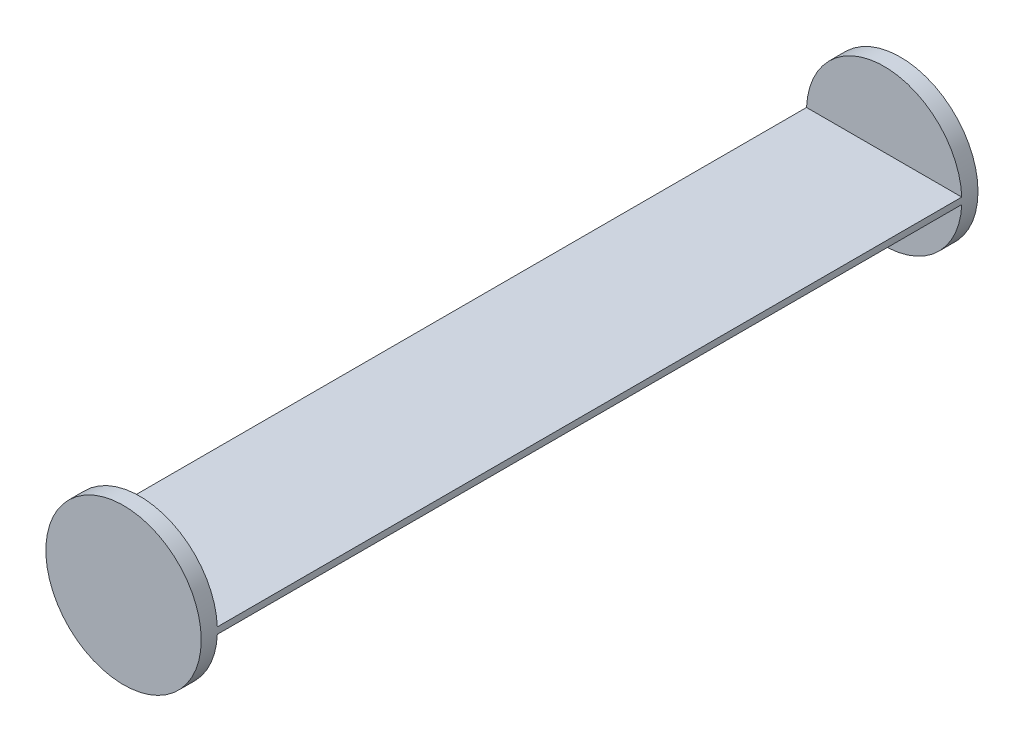
ISO-10303-21;
HEADER;
FILE_DESCRIPTION(('STEP AP214'),'2;1');
FILE_NAME('part.step','',(''),(''),'','','');
FILE_SCHEMA(('AUTOMOTIVE_DESIGN { 1 0 10303 214 1 1 1 1 }'));
ENDSEC;
DATA;
#1=APPLICATION_CONTEXT('core data for automotive mechanical design processes');
#2=APPLICATION_PROTOCOL_DEFINITION('international standard','automotive_design',2000,#1);
#3=PRODUCT_CONTEXT('',#1,'mechanical');
#4=PRODUCT('Part','Part','',(#3));
#5=PRODUCT_RELATED_PRODUCT_CATEGORY('part','',(#4));
#6=PRODUCT_DEFINITION_FORMATION('','',#4);
#7=PRODUCT_DEFINITION_CONTEXT('part definition',#1,'design');
#8=PRODUCT_DEFINITION('design','',#6,#7);
#9=PRODUCT_DEFINITION_SHAPE('','',#8);
#10=(LENGTH_UNIT() NAMED_UNIT(*) SI_UNIT(.MILLI.,.METRE.));
#11=(NAMED_UNIT(*) PLANE_ANGLE_UNIT() SI_UNIT($,.RADIAN.));
#12=(NAMED_UNIT(*) SI_UNIT($,.STERADIAN.) SOLID_ANGLE_UNIT());
#13=UNCERTAINTY_MEASURE_WITH_UNIT(LENGTH_MEASURE(1.E-05),#10,'distance_accuracy_value','');
#14=(GEOMETRIC_REPRESENTATION_CONTEXT(3) GLOBAL_UNCERTAINTY_ASSIGNED_CONTEXT((#13)) GLOBAL_UNIT_ASSIGNED_CONTEXT((#10,
#11,#12)) REPRESENTATION_CONTEXT('',''));
#15=CARTESIAN_POINT('',(0.,0.,0.));
#16=DIRECTION('',(0.,0.,1.));
#17=DIRECTION('',(1.,0.,0.));
#18=AXIS2_PLACEMENT_3D('',#15,#16,#17);
#19=CARTESIAN_POINT('',(0.,0.,-120.));
#20=DIRECTION('',(0.,0.,1.));
#21=DIRECTION('',(1.,0.,0.));
#22=AXIS2_PLACEMENT_3D('',#19,#20,#21);
#23=CYLINDRICAL_SURFACE('',#22,24.);
#24=DIRECTION('',(0.,0.,1.));
#25=VECTOR('',#24,1.);
#26=CARTESIAN_POINT('',(23.9791576165636,1.,-120.));
#27=LINE('',#26,#25);
#28=CARTESIAN_POINT('',(23.9791576165636,1.,115.));
#29=VERTEX_POINT('',#28);
#30=CARTESIAN_POINT('',(23.9791576165636,1.,-115.));
#31=VERTEX_POINT('',#30);
#32=EDGE_CURVE('E78',#29,#31,#27,.F.);
#33=ORIENTED_EDGE('',*,*,#32,.F.);
#34=CARTESIAN_POINT('',(0.,0.,115.));
#35=DIRECTION('',(0.,0.,1.));
#36=DIRECTION('',(1.,0.,0.));
#37=AXIS2_PLACEMENT_3D('',#34,#35,#36);
#38=CIRCLE('',#37,24.);
#39=CARTESIAN_POINT('',(-23.9791576165636,1.,115.));
#40=VERTEX_POINT('',#39);
#41=EDGE_CURVE('E91',#40,#29,#38,.F.);
#42=ORIENTED_EDGE('',*,*,#41,.F.);
#43=DIRECTION('',(0.,0.,1.));
#44=VECTOR('',#43,1.);
#45=CARTESIAN_POINT('',(-23.9791576165636,1.,-120.));
#46=LINE('',#45,#44);
#47=CARTESIAN_POINT('',(-23.9791576165636,1.,-115.));
#48=VERTEX_POINT('',#47);
#49=EDGE_CURVE('E95',#48,#40,#46,.T.);
#50=ORIENTED_EDGE('',*,*,#49,.F.);
#51=CARTESIAN_POINT('',(0.,0.,-115.));
#52=DIRECTION('',(0.,0.,-1.));
#53=DIRECTION('',(-1.,0.,0.));
#54=AXIS2_PLACEMENT_3D('',#51,#52,#53);
#55=CIRCLE('',#54,24.);
#56=EDGE_CURVE('E93',#31,#48,#55,.F.);
#57=ORIENTED_EDGE('',*,*,#56,.F.);
#58=EDGE_LOOP('',(#33,#42,#50,#57));
#59=FACE_BOUND('',#58,.T.);
#60=CARTESIAN_POINT('',(0.,0.,-120.));
#61=DIRECTION('',(0.,0.,1.));
#62=DIRECTION('',(1.,0.,0.));
#63=AXIS2_PLACEMENT_3D('',#60,#61,#62);
#64=CIRCLE('',#63,24.);
#65=CARTESIAN_POINT('',(24.,0.,-120.));
#66=VERTEX_POINT('',#65);
#67=EDGE_CURVE('E97',#66,#66,#64,.T.);
#68=ORIENTED_EDGE('',*,*,#67,.T.);
#69=EDGE_LOOP('',(#68));
#70=FACE_BOUND('',#69,.T.);
#71=CARTESIAN_POINT('',(0.,0.,120.));
#72=DIRECTION('',(0.,0.,1.));
#73=DIRECTION('',(1.,0.,0.));
#74=AXIS2_PLACEMENT_3D('',#71,#72,#73);
#75=CIRCLE('',#74,24.);
#76=CARTESIAN_POINT('',(24.,0.,120.));
#77=VERTEX_POINT('',#76);
#78=EDGE_CURVE('E100',#77,#77,#75,.T.);
#79=ORIENTED_EDGE('',*,*,#78,.F.);
#80=EDGE_LOOP('',(#79));
#81=FACE_BOUND('',#80,.T.);
#82=DIRECTION('',(0.,0.,1.));
#83=VECTOR('',#82,1.);
#84=CARTESIAN_POINT('',(23.9791576165636,-1.,-120.));
#85=LINE('',#84,#83);
#86=CARTESIAN_POINT('',(23.9791576165636,-1.,115.));
#87=VERTEX_POINT('',#86);
#88=CARTESIAN_POINT('',(23.9791576165636,-1.,-115.));
#89=VERTEX_POINT('',#88);
#90=EDGE_CURVE('E11',#87,#89,#85,.F.);
#91=ORIENTED_EDGE('',*,*,#90,.T.);
#92=CARTESIAN_POINT('',(0.,0.,-115.));
#93=DIRECTION('',(0.,0.,1.));
#94=DIRECTION('',(1.,0.,0.));
#95=AXIS2_PLACEMENT_3D('',#92,#93,#94);
#96=CIRCLE('',#95,24.);
#97=CARTESIAN_POINT('',(-23.9791576165636,-1.,-115.));
#98=VERTEX_POINT('',#97);
#99=EDGE_CURVE('E73',#89,#98,#96,.F.);
#100=ORIENTED_EDGE('',*,*,#99,.T.);
#101=DIRECTION('',(0.,0.,1.));
#102=VECTOR('',#101,1.);
#103=CARTESIAN_POINT('',(-23.9791576165636,-1.,-120.));
#104=LINE('',#103,#102);
#105=CARTESIAN_POINT('',(-23.9791576165636,-1.,115.));
#106=VERTEX_POINT('',#105);
#107=EDGE_CURVE('E77',#98,#106,#104,.T.);
#108=ORIENTED_EDGE('',*,*,#107,.T.);
#109=CARTESIAN_POINT('',(0.,0.,115.));
#110=DIRECTION('',(0.,0.,-1.));
#111=DIRECTION('',(-1.,0.,0.));
#112=AXIS2_PLACEMENT_3D('',#109,#110,#111);
#113=CIRCLE('',#112,24.);
#114=EDGE_CURVE('E41',#106,#87,#113,.F.);
#115=ORIENTED_EDGE('',*,*,#114,.T.);
#116=EDGE_LOOP('',(#91,#100,#108,#115));
#117=FACE_BOUND('',#116,.T.);
#118=ADVANCED_FACE('F34',(#59,#70,#81,#117),#23,.T.);
#119=CARTESIAN_POINT('',(0.,0.,-120.));
#120=DIRECTION('',(0.,0.,1.));
#121=DIRECTION('',(1.,0.,0.));
#122=AXIS2_PLACEMENT_3D('',#119,#120,#121);
#123=PLANE('',#122);
#124=ORIENTED_EDGE('',*,*,#67,.F.);
#125=EDGE_LOOP('',(#124));
#126=FACE_BOUND('',#125,.T.);
#127=ADVANCED_FACE('F121',(#126),#123,.F.);
#128=CARTESIAN_POINT('',(0.,0.,120.));
#129=DIRECTION('',(0.,0.,1.));
#130=DIRECTION('',(1.,0.,0.));
#131=AXIS2_PLACEMENT_3D('',#128,#129,#130);
#132=PLANE('',#131);
#133=ORIENTED_EDGE('',*,*,#78,.T.);
#134=EDGE_LOOP('',(#133));
#135=FACE_BOUND('',#134,.T.);
#136=ADVANCED_FACE('F126',(#135),#132,.T.);
#137=CARTESIAN_POINT('',(-24.,24.,115.));
#138=DIRECTION('',(0.,0.,1.));
#139=DIRECTION('',(1.,0.,0.));
#140=AXIS2_PLACEMENT_3D('',#137,#138,#139);
#141=PLANE('',#140);
#142=ORIENTED_EDGE('',*,*,#41,.T.);
#143=DIRECTION('',(1.,0.,0.));
#144=VECTOR('',#143,1.);
#145=CARTESIAN_POINT('',(-24.,1.,115.));
#146=LINE('',#145,#144);
#147=EDGE_CURVE('E103',#40,#29,#146,.T.);
#148=ORIENTED_EDGE('',*,*,#147,.F.);
#149=EDGE_LOOP('',(#142,#148));
#150=FACE_BOUND('',#149,.T.);
#151=ADVANCED_FACE('F136',(#150),#141,.F.);
#152=CARTESIAN_POINT('',(-24.,24.,-115.));
#153=DIRECTION('',(0.,0.,-1.));
#154=DIRECTION('',(-1.,0.,0.));
#155=AXIS2_PLACEMENT_3D('',#152,#153,#154);
#156=PLANE('',#155);
#157=DIRECTION('',(1.,0.,0.));
#158=VECTOR('',#157,1.);
#159=CARTESIAN_POINT('',(-24.,1.,-115.));
#160=LINE('',#159,#158);
#161=EDGE_CURVE('E55',#48,#31,#160,.T.);
#162=ORIENTED_EDGE('',*,*,#161,.T.);
#163=ORIENTED_EDGE('',*,*,#56,.T.);
#164=EDGE_LOOP('',(#162,#163));
#165=FACE_BOUND('',#164,.T.);
#166=ADVANCED_FACE('F116',(#165),#156,.F.);
#167=CARTESIAN_POINT('',(-24.,1.,115.));
#168=DIRECTION('',(0.,-1.,0.));
#169=DIRECTION('',(0.,0.,-1.));
#170=AXIS2_PLACEMENT_3D('',#167,#168,#169);
#171=PLANE('',#170);
#172=ORIENTED_EDGE('',*,*,#32,.T.);
#173=ORIENTED_EDGE('',*,*,#161,.F.);
#174=ORIENTED_EDGE('',*,*,#49,.T.);
#175=ORIENTED_EDGE('',*,*,#147,.T.);
#176=EDGE_LOOP('',(#172,#173,#174,#175));
#177=FACE_BOUND('',#176,.T.);
#178=ADVANCED_FACE('F109',(#177),#171,.F.);
#179=CARTESIAN_POINT('',(-24.,-24.,115.));
#180=DIRECTION('',(0.,0.,-1.));
#181=DIRECTION('',(-1.,0.,0.));
#182=AXIS2_PLACEMENT_3D('',#179,#180,#181);
#183=PLANE('',#182);
#184=DIRECTION('',(1.,0.,0.));
#185=VECTOR('',#184,1.);
#186=CARTESIAN_POINT('',(-24.,-1.,115.));
#187=LINE('',#186,#185);
#188=EDGE_CURVE('E84',#106,#87,#187,.T.);
#189=ORIENTED_EDGE('',*,*,#188,.T.);
#190=ORIENTED_EDGE('',*,*,#114,.F.);
#191=EDGE_LOOP('',(#189,#190));
#192=FACE_BOUND('',#191,.T.);
#193=ADVANCED_FACE('F107',(#192),#183,.T.);
#194=CARTESIAN_POINT('',(-24.,-1.,115.));
#195=DIRECTION('',(0.,-1.,0.));
#196=DIRECTION('',(0.,0.,-1.));
#197=AXIS2_PLACEMENT_3D('',#194,#195,#196);
#198=PLANE('',#197);
#199=ORIENTED_EDGE('',*,*,#188,.F.);
#200=ORIENTED_EDGE('',*,*,#107,.F.);
#201=DIRECTION('',(1.,0.,0.));
#202=VECTOR('',#201,1.);
#203=CARTESIAN_POINT('',(-24.,-1.,-115.));
#204=LINE('',#203,#202);
#205=EDGE_CURVE('E47',#98,#89,#204,.T.);
#206=ORIENTED_EDGE('',*,*,#205,.T.);
#207=ORIENTED_EDGE('',*,*,#90,.F.);
#208=EDGE_LOOP('',(#199,#200,#206,#207));
#209=FACE_BOUND('',#208,.T.);
#210=ADVANCED_FACE('F82',(#209),#198,.T.);
#211=CARTESIAN_POINT('',(-24.,-24.,-115.));
#212=DIRECTION('',(0.,0.,1.));
#213=DIRECTION('',(1.,0.,0.));
#214=AXIS2_PLACEMENT_3D('',#211,#212,#213);
#215=PLANE('',#214);
#216=ORIENTED_EDGE('',*,*,#205,.F.);
#217=ORIENTED_EDGE('',*,*,#99,.F.);
#218=EDGE_LOOP('',(#216,#217));
#219=FACE_BOUND('',#218,.T.);
#220=ADVANCED_FACE('F74',(#219),#215,.T.);
#221=CLOSED_SHELL('',(#118,#127,#136,#151,#166,#178,#193,#210,#220));
#222=MANIFOLD_SOLID_BREP('B2',#221);
#223=ADVANCED_BREP_SHAPE_REPRESENTATION('',(#18,#222),#14);
#224=SHAPE_DEFINITION_REPRESENTATION(#9,#223);
ENDSEC;
END-ISO-10303-21;
